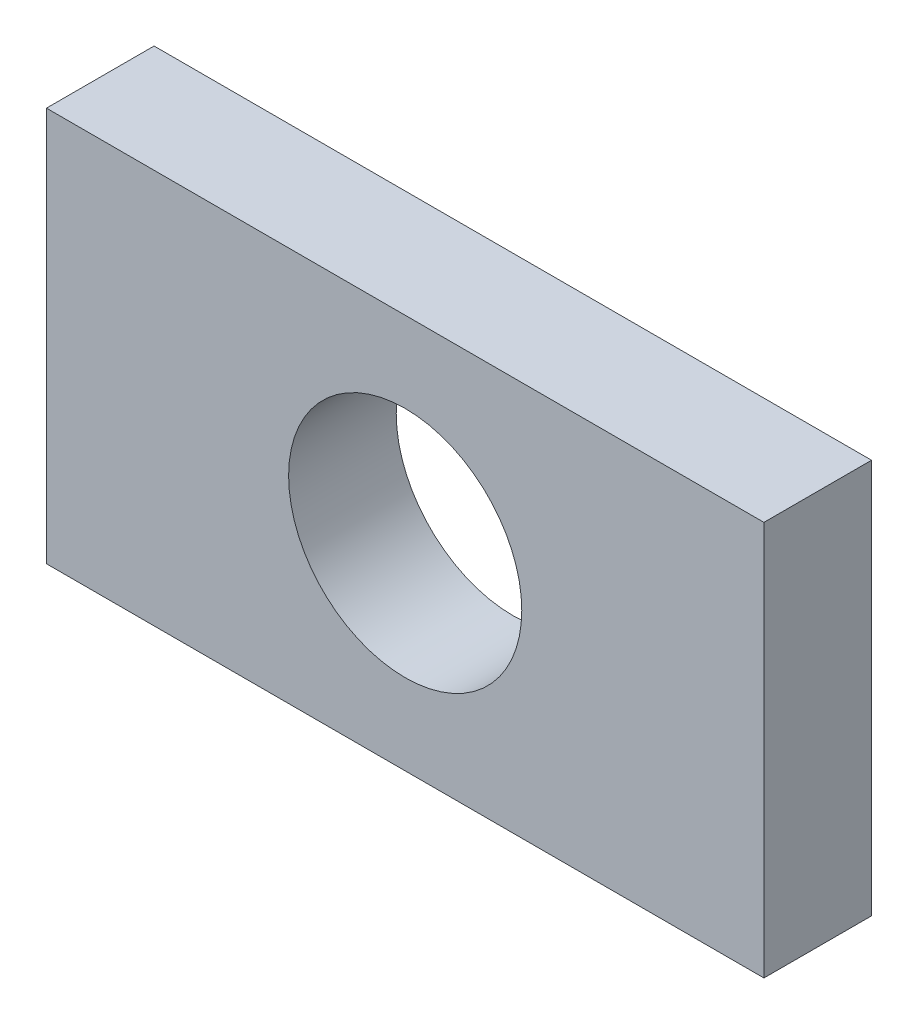
ISO-10303-21;
HEADER;
FILE_DESCRIPTION(('STEP AP214'),'2;1');
FILE_NAME('part.step','',(''),(''),'','','');
FILE_SCHEMA(('AUTOMOTIVE_DESIGN { 1 0 10303 214 1 1 1 1 }'));
ENDSEC;
DATA;
#1=APPLICATION_CONTEXT('core data for automotive mechanical design processes');
#2=APPLICATION_PROTOCOL_DEFINITION('international standard','automotive_design',2000,#1);
#3=PRODUCT_CONTEXT('',#1,'mechanical');
#4=PRODUCT('Part','Part','',(#3));
#5=PRODUCT_RELATED_PRODUCT_CATEGORY('part','',(#4));
#6=PRODUCT_DEFINITION_FORMATION('','',#4);
#7=PRODUCT_DEFINITION_CONTEXT('part definition',#1,'design');
#8=PRODUCT_DEFINITION('design','',#6,#7);
#9=PRODUCT_DEFINITION_SHAPE('','',#8);
#10=(LENGTH_UNIT() NAMED_UNIT(*) SI_UNIT(.MILLI.,.METRE.));
#11=(NAMED_UNIT(*) PLANE_ANGLE_UNIT() SI_UNIT($,.RADIAN.));
#12=(NAMED_UNIT(*) SI_UNIT($,.STERADIAN.) SOLID_ANGLE_UNIT());
#13=UNCERTAINTY_MEASURE_WITH_UNIT(LENGTH_MEASURE(1.E-05),#10,'distance_accuracy_value','');
#14=(GEOMETRIC_REPRESENTATION_CONTEXT(3) GLOBAL_UNCERTAINTY_ASSIGNED_CONTEXT((#13)) GLOBAL_UNIT_ASSIGNED_CONTEXT((#10,
#11,#12)) REPRESENTATION_CONTEXT('',''));
#15=CARTESIAN_POINT('',(0.,0.,0.));
#16=DIRECTION('',(0.,0.,1.));
#17=DIRECTION('',(1.,0.,0.));
#18=AXIS2_PLACEMENT_3D('',#15,#16,#17);
#19=CARTESIAN_POINT('',(-10.,417.,-3.));
#20=DIRECTION('',(-1.,0.,0.));
#21=DIRECTION('',(0.,-1.,0.));
#22=AXIS2_PLACEMENT_3D('',#19,#20,#21);
#23=PLANE('',#22);
#24=DIRECTION('',(0.,-1.,0.));
#25=VECTOR('',#24,1.);
#26=CARTESIAN_POINT('',(-10.,417.,0.));
#27=LINE('',#26,#25);
#28=CARTESIAN_POINT('',(-10.,417.,0.));
#29=VERTEX_POINT('',#28);
#30=CARTESIAN_POINT('',(-10.,406.,0.));
#31=VERTEX_POINT('',#30);
#32=EDGE_CURVE('E97',#29,#31,#27,.T.);
#33=ORIENTED_EDGE('',*,*,#32,.F.);
#34=DIRECTION('',(0.,0.,1.));
#35=VECTOR('',#34,1.);
#36=CARTESIAN_POINT('',(-10.,417.,-3.));
#37=LINE('',#36,#35);
#38=CARTESIAN_POINT('',(-10.,417.,-3.));
#39=VERTEX_POINT('',#38);
#40=EDGE_CURVE('E11',#39,#29,#37,.T.);
#41=ORIENTED_EDGE('',*,*,#40,.F.);
#42=DIRECTION('',(0.,-1.,0.));
#43=VECTOR('',#42,1.);
#44=CARTESIAN_POINT('',(-10.,417.,-3.));
#45=LINE('',#44,#43);
#46=CARTESIAN_POINT('',(-10.,406.,-3.));
#47=VERTEX_POINT('',#46);
#48=EDGE_CURVE('E90',#39,#47,#45,.T.);
#49=ORIENTED_EDGE('',*,*,#48,.T.);
#50=DIRECTION('',(0.,0.,1.));
#51=VECTOR('',#50,1.);
#52=CARTESIAN_POINT('',(-10.,406.,-3.));
#53=LINE('',#52,#51);
#54=EDGE_CURVE('E35',#47,#31,#53,.T.);
#55=ORIENTED_EDGE('',*,*,#54,.T.);
#56=EDGE_LOOP('',(#33,#41,#49,#55));
#57=FACE_BOUND('',#56,.T.);
#58=ADVANCED_FACE('F32',(#57),#23,.T.);
#59=CARTESIAN_POINT('',(-10.,417.,-3.));
#60=DIRECTION('',(0.,1.,0.));
#61=DIRECTION('',(0.,0.,1.));
#62=AXIS2_PLACEMENT_3D('',#59,#60,#61);
#63=PLANE('',#62);
#64=DIRECTION('',(-1.,0.,0.));
#65=VECTOR('',#64,1.);
#66=CARTESIAN_POINT('',(-10.,417.,0.));
#67=LINE('',#66,#65);
#68=CARTESIAN_POINT('',(10.,417.,0.));
#69=VERTEX_POINT('',#68);
#70=EDGE_CURVE('E92',#69,#29,#67,.T.);
#71=ORIENTED_EDGE('',*,*,#70,.F.);
#72=DIRECTION('',(0.,0.,1.));
#73=VECTOR('',#72,1.);
#74=CARTESIAN_POINT('',(10.,417.,-3.));
#75=LINE('',#74,#73);
#76=CARTESIAN_POINT('',(10.,417.,-3.));
#77=VERTEX_POINT('',#76);
#78=EDGE_CURVE('E41',#77,#69,#75,.T.);
#79=ORIENTED_EDGE('',*,*,#78,.F.);
#80=DIRECTION('',(-1.,0.,0.));
#81=VECTOR('',#80,1.);
#82=CARTESIAN_POINT('',(-10.,417.,-3.));
#83=LINE('',#82,#81);
#84=EDGE_CURVE('E87',#77,#39,#83,.T.);
#85=ORIENTED_EDGE('',*,*,#84,.T.);
#86=ORIENTED_EDGE('',*,*,#40,.T.);
#87=EDGE_LOOP('',(#71,#79,#85,#86));
#88=FACE_BOUND('',#87,.T.);
#89=ADVANCED_FACE('F108',(#88),#63,.T.);
#90=CARTESIAN_POINT('',(10.,417.,-3.));
#91=DIRECTION('',(1.,0.,0.));
#92=DIRECTION('',(0.,0.,-1.));
#93=AXIS2_PLACEMENT_3D('',#90,#91,#92);
#94=PLANE('',#93);
#95=DIRECTION('',(0.,1.,0.));
#96=VECTOR('',#95,1.);
#97=CARTESIAN_POINT('',(10.,417.,0.));
#98=LINE('',#97,#96);
#99=CARTESIAN_POINT('',(10.,406.,0.));
#100=VERTEX_POINT('',#99);
#101=EDGE_CURVE('E82',#100,#69,#98,.T.);
#102=ORIENTED_EDGE('',*,*,#101,.F.);
#103=DIRECTION('',(0.,0.,1.));
#104=VECTOR('',#103,1.);
#105=CARTESIAN_POINT('',(10.,406.,-3.));
#106=LINE('',#105,#104);
#107=CARTESIAN_POINT('',(10.,406.,-3.));
#108=VERTEX_POINT('',#107);
#109=EDGE_CURVE('E77',#108,#100,#106,.T.);
#110=ORIENTED_EDGE('',*,*,#109,.F.);
#111=DIRECTION('',(0.,1.,0.));
#112=VECTOR('',#111,1.);
#113=CARTESIAN_POINT('',(10.,417.,-3.));
#114=LINE('',#113,#112);
#115=EDGE_CURVE('E80',#108,#77,#114,.T.);
#116=ORIENTED_EDGE('',*,*,#115,.T.);
#117=ORIENTED_EDGE('',*,*,#78,.T.);
#118=EDGE_LOOP('',(#102,#110,#116,#117));
#119=FACE_BOUND('',#118,.T.);
#120=ADVANCED_FACE('F79',(#119),#94,.T.);
#121=CARTESIAN_POINT('',(-10.,406.,-3.));
#122=DIRECTION('',(0.,-1.,0.));
#123=DIRECTION('',(0.,0.,-1.));
#124=AXIS2_PLACEMENT_3D('',#121,#122,#123);
#125=PLANE('',#124);
#126=DIRECTION('',(1.,0.,0.));
#127=VECTOR('',#126,1.);
#128=CARTESIAN_POINT('',(-10.,406.,0.));
#129=LINE('',#128,#127);
#130=EDGE_CURVE('E100',#31,#100,#129,.T.);
#131=ORIENTED_EDGE('',*,*,#130,.F.);
#132=ORIENTED_EDGE('',*,*,#54,.F.);
#133=DIRECTION('',(1.,0.,0.));
#134=VECTOR('',#133,1.);
#135=CARTESIAN_POINT('',(-10.,406.,-3.));
#136=LINE('',#135,#134);
#137=EDGE_CURVE('E86',#47,#108,#136,.T.);
#138=ORIENTED_EDGE('',*,*,#137,.T.);
#139=ORIENTED_EDGE('',*,*,#109,.T.);
#140=EDGE_LOOP('',(#131,#132,#138,#139));
#141=FACE_BOUND('',#140,.T.);
#142=ADVANCED_FACE('F89',(#141),#125,.T.);
#143=CARTESIAN_POINT('',(0.,0.,-3.));
#144=DIRECTION('',(0.,0.,1.));
#145=DIRECTION('',(1.,0.,0.));
#146=AXIS2_PLACEMENT_3D('',#143,#144,#145);
#147=PLANE('',#146);
#148=CARTESIAN_POINT('',(0.,411.5,-3.));
#149=DIRECTION('',(0.,0.,1.));
#150=DIRECTION('',(1.,0.,0.));
#151=AXIS2_PLACEMENT_3D('',#148,#149,#150);
#152=CIRCLE('',#151,3.25);
#153=CARTESIAN_POINT('',(3.25,411.5,-3.));
#154=VERTEX_POINT('',#153);
#155=EDGE_CURVE('E101',#154,#154,#152,.T.);
#156=ORIENTED_EDGE('',*,*,#155,.T.);
#157=EDGE_LOOP('',(#156));
#158=FACE_BOUND('',#157,.T.);
#159=ORIENTED_EDGE('',*,*,#48,.F.);
#160=ORIENTED_EDGE('',*,*,#84,.F.);
#161=ORIENTED_EDGE('',*,*,#115,.F.);
#162=ORIENTED_EDGE('',*,*,#137,.F.);
#163=EDGE_LOOP('',(#159,#160,#161,#162));
#164=FACE_BOUND('',#163,.T.);
#165=ADVANCED_FACE('F85',(#158,#164),#147,.F.);
#166=CARTESIAN_POINT('',(0.,0.,0.));
#167=DIRECTION('',(0.,0.,1.));
#168=DIRECTION('',(1.,0.,0.));
#169=AXIS2_PLACEMENT_3D('',#166,#167,#168);
#170=PLANE('',#169);
#171=CARTESIAN_POINT('',(0.,411.5,0.));
#172=DIRECTION('',(0.,0.,1.));
#173=DIRECTION('',(1.,0.,0.));
#174=AXIS2_PLACEMENT_3D('',#171,#172,#173);
#175=CIRCLE('',#174,3.25);
#176=CARTESIAN_POINT('',(3.25,411.5,0.));
#177=VERTEX_POINT('',#176);
#178=EDGE_CURVE('E138',#177,#177,#175,.T.);
#179=ORIENTED_EDGE('',*,*,#178,.F.);
#180=EDGE_LOOP('',(#179));
#181=FACE_BOUND('',#180,.T.);
#182=ORIENTED_EDGE('',*,*,#32,.T.);
#183=ORIENTED_EDGE('',*,*,#130,.T.);
#184=ORIENTED_EDGE('',*,*,#101,.T.);
#185=ORIENTED_EDGE('',*,*,#70,.T.);
#186=EDGE_LOOP('',(#182,#183,#184,#185));
#187=FACE_BOUND('',#186,.T.);
#188=ADVANCED_FACE('F107',(#181,#187),#170,.T.);
#189=CARTESIAN_POINT('',(0.,411.5,-3.));
#190=DIRECTION('',(0.,0.,1.));
#191=DIRECTION('',(1.,0.,0.));
#192=AXIS2_PLACEMENT_3D('',#189,#190,#191);
#193=CYLINDRICAL_SURFACE('',#192,3.25);
#194=ORIENTED_EDGE('',*,*,#155,.F.);
#195=EDGE_LOOP('',(#194));
#196=FACE_BOUND('',#195,.T.);
#197=ORIENTED_EDGE('',*,*,#178,.T.);
#198=EDGE_LOOP('',(#197));
#199=FACE_BOUND('',#198,.T.);
#200=ADVANCED_FACE('F126',(#196,#199),#193,.F.);
#201=CLOSED_SHELL('',(#58,#89,#120,#142,#165,#188,#200));
#202=MANIFOLD_SOLID_BREP('B2',#201);
#203=ADVANCED_BREP_SHAPE_REPRESENTATION('',(#18,#202),#14);
#204=SHAPE_DEFINITION_REPRESENTATION(#9,#203);
ENDSEC;
END-ISO-10303-21;
